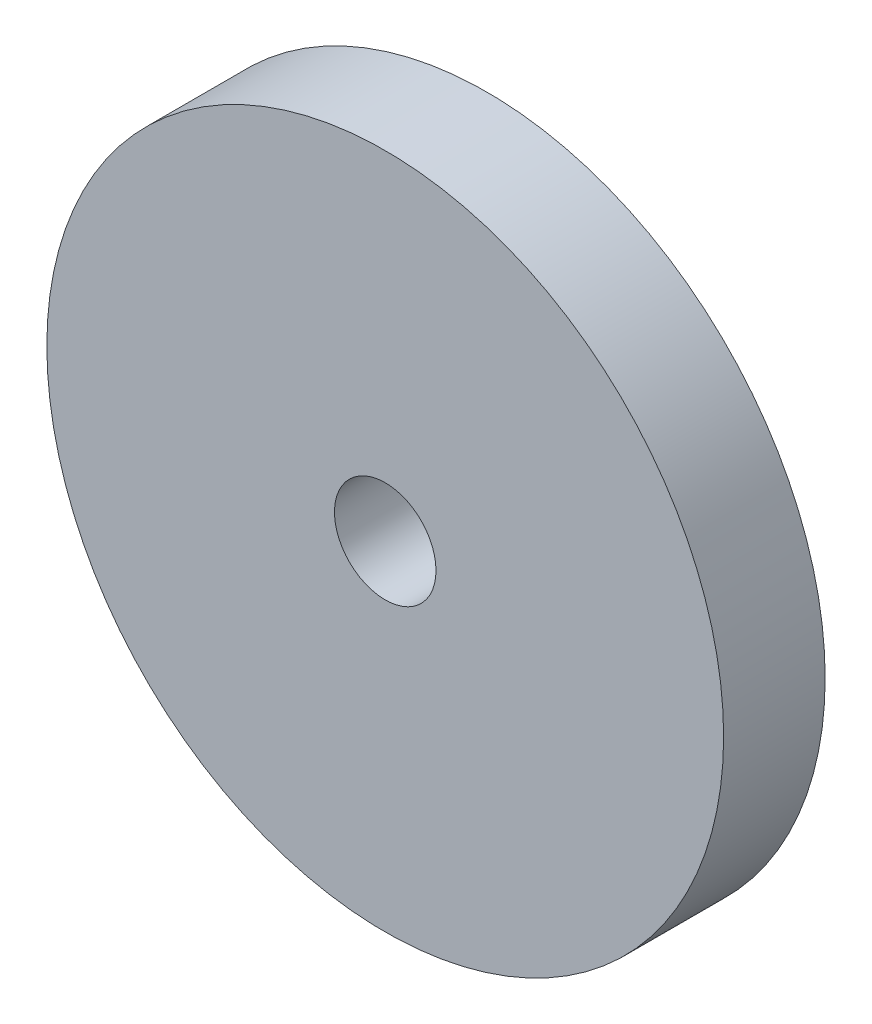
ISO-10303-21;
HEADER;
FILE_DESCRIPTION(('STEP AP214'),'2;1');
FILE_NAME('part.step','',(''),(''),'','','');
FILE_SCHEMA(('AUTOMOTIVE_DESIGN { 1 0 10303 214 1 1 1 1 }'));
ENDSEC;
DATA;
#1=APPLICATION_CONTEXT('core data for automotive mechanical design processes');
#2=APPLICATION_PROTOCOL_DEFINITION('international standard','automotive_design',2000,#1);
#3=PRODUCT_CONTEXT('',#1,'mechanical');
#4=PRODUCT('Part','Part','',(#3));
#5=PRODUCT_RELATED_PRODUCT_CATEGORY('part','',(#4));
#6=PRODUCT_DEFINITION_FORMATION('','',#4);
#7=PRODUCT_DEFINITION_CONTEXT('part definition',#1,'design');
#8=PRODUCT_DEFINITION('design','',#6,#7);
#9=PRODUCT_DEFINITION_SHAPE('','',#8);
#10=(LENGTH_UNIT() NAMED_UNIT(*) SI_UNIT(.MILLI.,.METRE.));
#11=(NAMED_UNIT(*) PLANE_ANGLE_UNIT() SI_UNIT($,.RADIAN.));
#12=(NAMED_UNIT(*) SI_UNIT($,.STERADIAN.) SOLID_ANGLE_UNIT());
#13=UNCERTAINTY_MEASURE_WITH_UNIT(LENGTH_MEASURE(1.E-05),#10,'distance_accuracy_value','');
#14=(GEOMETRIC_REPRESENTATION_CONTEXT(3) GLOBAL_UNCERTAINTY_ASSIGNED_CONTEXT((#13)) GLOBAL_UNIT_ASSIGNED_CONTEXT((#10,
#11,#12)) REPRESENTATION_CONTEXT('',''));
#15=CARTESIAN_POINT('',(0.,0.,0.));
#16=DIRECTION('',(0.,0.,1.));
#17=DIRECTION('',(1.,0.,0.));
#18=AXIS2_PLACEMENT_3D('',#15,#16,#17);
#19=CARTESIAN_POINT('',(-70.740767530641,50.2183790892652,3.));
#20=DIRECTION('',(0.,0.,1.));
#21=DIRECTION('',(1.,0.,0.));
#22=AXIS2_PLACEMENT_3D('',#19,#20,#21);
#23=PLANE('',#22);
#24=CARTESIAN_POINT('',(-70.740767530641,50.2183790892652,3.));
#25=DIRECTION('',(0.,0.,1.));
#26=DIRECTION('',(1.,0.,0.));
#27=AXIS2_PLACEMENT_3D('',#24,#25,#26);
#28=CIRCLE('',#27,10.);
#29=CARTESIAN_POINT('',(-60.740767530641,50.2183790892652,3.));
#30=VERTEX_POINT('',#29);
#31=EDGE_CURVE('E11',#30,#30,#28,.T.);
#32=ORIENTED_EDGE('',*,*,#31,.T.);
#33=EDGE_LOOP('',(#32));
#34=FACE_BOUND('',#33,.T.);
#35=CARTESIAN_POINT('',(-70.740767530641,50.2183790892652,3.));
#36=DIRECTION('',(0.,0.,1.));
#37=DIRECTION('',(1.,0.,0.));
#38=AXIS2_PLACEMENT_3D('',#35,#36,#37);
#39=CIRCLE('',#38,1.5);
#40=CARTESIAN_POINT('',(-69.240767530641,50.2183790892652,3.));
#41=VERTEX_POINT('',#40);
#42=EDGE_CURVE('E49',#41,#41,#39,.T.);
#43=ORIENTED_EDGE('',*,*,#42,.F.);
#44=EDGE_LOOP('',(#43));
#45=FACE_BOUND('',#44,.T.);
#46=ADVANCED_FACE('F36',(#34,#45),#23,.T.);
#47=CARTESIAN_POINT('',(-70.740767530641,50.2183790892652,0.));
#48=DIRECTION('',(0.,0.,1.));
#49=DIRECTION('',(1.,0.,0.));
#50=AXIS2_PLACEMENT_3D('',#47,#48,#49);
#51=PLANE('',#50);
#52=CARTESIAN_POINT('',(-70.740767530641,50.2183790892652,0.));
#53=DIRECTION('',(0.,0.,1.));
#54=DIRECTION('',(1.,0.,0.));
#55=AXIS2_PLACEMENT_3D('',#52,#53,#54);
#56=CIRCLE('',#55,10.);
#57=CARTESIAN_POINT('',(-60.740767530641,50.2183790892652,0.));
#58=VERTEX_POINT('',#57);
#59=EDGE_CURVE('E40',#58,#58,#56,.T.);
#60=ORIENTED_EDGE('',*,*,#59,.F.);
#61=EDGE_LOOP('',(#60));
#62=FACE_BOUND('',#61,.T.);
#63=CARTESIAN_POINT('',(-70.740767530641,50.2183790892652,0.));
#64=DIRECTION('',(0.,0.,1.));
#65=DIRECTION('',(1.,0.,0.));
#66=AXIS2_PLACEMENT_3D('',#63,#64,#65);
#67=CIRCLE('',#66,1.5);
#68=CARTESIAN_POINT('',(-69.240767530641,50.2183790892652,0.));
#69=VERTEX_POINT('',#68);
#70=EDGE_CURVE('E52',#69,#69,#67,.T.);
#71=ORIENTED_EDGE('',*,*,#70,.T.);
#72=EDGE_LOOP('',(#71));
#73=FACE_BOUND('',#72,.T.);
#74=ADVANCED_FACE('F62',(#62,#73),#51,.F.);
#75=CARTESIAN_POINT('',(-70.740767530641,50.2183790892652,3.));
#76=DIRECTION('',(0.,0.,-1.));
#77=DIRECTION('',(-1.,0.,0.));
#78=AXIS2_PLACEMENT_3D('',#75,#76,#77);
#79=CYLINDRICAL_SURFACE('',#78,10.);
#80=ORIENTED_EDGE('',*,*,#31,.F.);
#81=EDGE_LOOP('',(#80));
#82=FACE_BOUND('',#81,.T.);
#83=ORIENTED_EDGE('',*,*,#59,.T.);
#84=EDGE_LOOP('',(#83));
#85=FACE_BOUND('',#84,.T.);
#86=ADVANCED_FACE('F38',(#82,#85),#79,.T.);
#87=CARTESIAN_POINT('',(-70.740767530641,50.2183790892652,3.));
#88=DIRECTION('',(0.,0.,-1.));
#89=DIRECTION('',(-1.,0.,0.));
#90=AXIS2_PLACEMENT_3D('',#87,#88,#89);
#91=CYLINDRICAL_SURFACE('',#90,1.5);
#92=ORIENTED_EDGE('',*,*,#42,.T.);
#93=EDGE_LOOP('',(#92));
#94=FACE_BOUND('',#93,.T.);
#95=ORIENTED_EDGE('',*,*,#70,.F.);
#96=EDGE_LOOP('',(#95));
#97=FACE_BOUND('',#96,.T.);
#98=ADVANCED_FACE('F58',(#94,#97),#91,.F.);
#99=CLOSED_SHELL('',(#46,#74,#86,#98));
#100=MANIFOLD_SOLID_BREP('B2',#99);
#101=ADVANCED_BREP_SHAPE_REPRESENTATION('',(#18,#100),#14);
#102=SHAPE_DEFINITION_REPRESENTATION(#9,#101);
ENDSEC;
END-ISO-10303-21;
